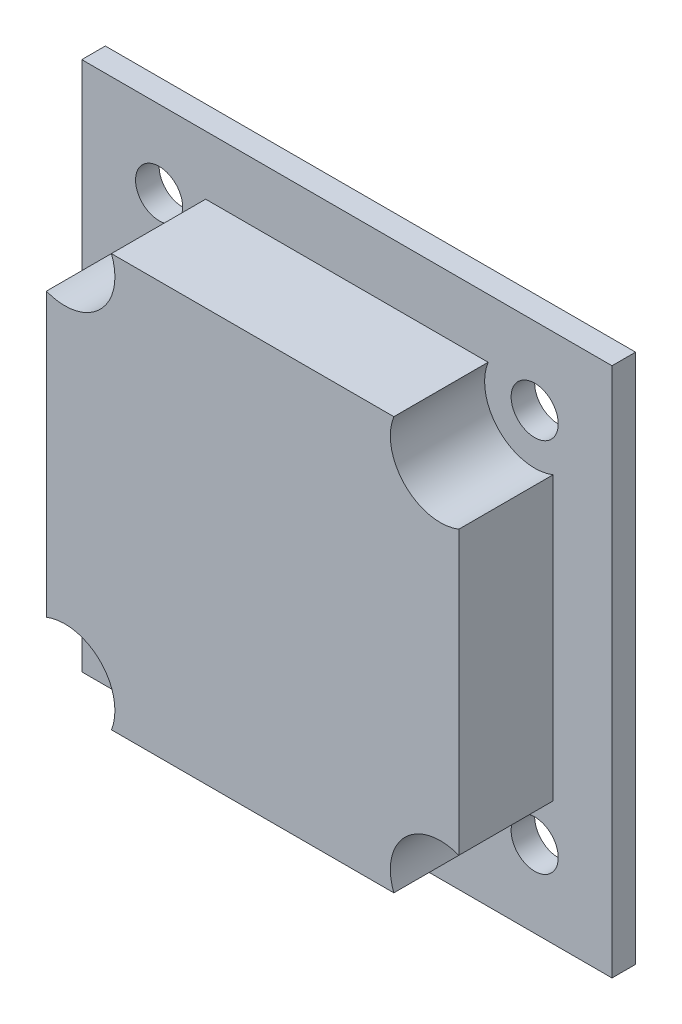
ISO-10303-21;
HEADER;
FILE_DESCRIPTION(('STEP AP214'),'2;1');
FILE_NAME('part.step','',(''),(''),'','','');
FILE_SCHEMA(('AUTOMOTIVE_DESIGN { 1 0 10303 214 1 1 1 1 }'));
ENDSEC;
DATA;
#1=APPLICATION_CONTEXT('core data for automotive mechanical design processes');
#2=APPLICATION_PROTOCOL_DEFINITION('international standard','automotive_design',2000,#1);
#3=PRODUCT_CONTEXT('',#1,'mechanical');
#4=PRODUCT('Part','Part','',(#3));
#5=PRODUCT_RELATED_PRODUCT_CATEGORY('part','',(#4));
#6=PRODUCT_DEFINITION_FORMATION('','',#4);
#7=PRODUCT_DEFINITION_CONTEXT('part definition',#1,'design');
#8=PRODUCT_DEFINITION('design','',#6,#7);
#9=PRODUCT_DEFINITION_SHAPE('','',#8);
#10=(LENGTH_UNIT() NAMED_UNIT(*) SI_UNIT(.MILLI.,.METRE.));
#11=(NAMED_UNIT(*) PLANE_ANGLE_UNIT() SI_UNIT($,.RADIAN.));
#12=(NAMED_UNIT(*) SI_UNIT($,.STERADIAN.) SOLID_ANGLE_UNIT());
#13=UNCERTAINTY_MEASURE_WITH_UNIT(LENGTH_MEASURE(1.E-05),#10,'distance_accuracy_value','');
#14=(GEOMETRIC_REPRESENTATION_CONTEXT(3) GLOBAL_UNCERTAINTY_ASSIGNED_CONTEXT((#13)) GLOBAL_UNIT_ASSIGNED_CONTEXT((#10,
#11,#12)) REPRESENTATION_CONTEXT('',''));
#15=CARTESIAN_POINT('',(0.,0.,0.));
#16=DIRECTION('',(0.,0.,1.));
#17=DIRECTION('',(1.,0.,0.));
#18=AXIS2_PLACEMENT_3D('',#15,#16,#17);
#19=CARTESIAN_POINT('',(0.,0.,12.));
#20=DIRECTION('',(0.,0.,1.));
#21=DIRECTION('',(1.,0.,0.));
#22=AXIS2_PLACEMENT_3D('',#19,#20,#21);
#23=PLANE('',#22);
#24=DIRECTION('',(-1.,0.,0.));
#25=VECTOR('',#24,1.);
#26=CARTESIAN_POINT('',(14.,14.,12.));
#27=LINE('',#26,#25);
#28=CARTESIAN_POINT('',(9.588117649248,14.,12.));
#29=VERTEX_POINT('',#28);
#30=CARTESIAN_POINT('',(-9.588117649248,14.,12.));
#31=VERTEX_POINT('',#30);
#32=EDGE_CURVE('E210',#29,#31,#27,.T.);
#33=ORIENTED_EDGE('',*,*,#32,.T.);
#34=CARTESIAN_POINT('',(-12.75,12.75,12.));
#35=DIRECTION('',(0.,0.,-1.));
#36=DIRECTION('',(0.92996539727996,0.367647058823984,0.));
#37=AXIS2_PLACEMENT_3D('',#34,#35,#36);
#38=CIRCLE('',#37,3.4);
#39=CARTESIAN_POINT('',(-14.,9.588117649248,12.));
#40=VERTEX_POINT('',#39);
#41=EDGE_CURVE('E209',#31,#40,#38,.T.);
#42=ORIENTED_EDGE('',*,*,#41,.T.);
#43=DIRECTION('',(0.,-1.,0.));
#44=VECTOR('',#43,1.);
#45=CARTESIAN_POINT('',(-14.,14.,12.));
#46=LINE('',#45,#44);
#47=CARTESIAN_POINT('',(-14.,-9.588117649248,12.));
#48=VERTEX_POINT('',#47);
#49=EDGE_CURVE('E23',#40,#48,#46,.T.);
#50=ORIENTED_EDGE('',*,*,#49,.T.);
#51=CARTESIAN_POINT('',(-12.75,-12.75,12.));
#52=DIRECTION('',(0.,0.,-1.));
#53=DIRECTION('',(-0.367647058823984,0.92996539727996,0.));
#54=AXIS2_PLACEMENT_3D('',#51,#52,#53);
#55=CIRCLE('',#54,3.4);
#56=CARTESIAN_POINT('',(-9.588117649248,-14.,12.));
#57=VERTEX_POINT('',#56);
#58=EDGE_CURVE('E9',#48,#57,#55,.T.);
#59=ORIENTED_EDGE('',*,*,#58,.T.);
#60=DIRECTION('',(1.,0.,0.));
#61=VECTOR('',#60,1.);
#62=CARTESIAN_POINT('',(-14.,-14.,12.));
#63=LINE('',#62,#61);
#64=CARTESIAN_POINT('',(9.588117649248,-14.,12.));
#65=VERTEX_POINT('',#64);
#66=EDGE_CURVE('E190',#57,#65,#63,.T.);
#67=ORIENTED_EDGE('',*,*,#66,.T.);
#68=CARTESIAN_POINT('',(12.75,-12.75,12.));
#69=DIRECTION('',(0.,0.,-1.));
#70=DIRECTION('',(1.,0.,0.));
#71=AXIS2_PLACEMENT_3D('',#68,#69,#70);
#72=CIRCLE('',#71,3.4);
#73=CARTESIAN_POINT('',(14.,-9.588117649248,12.));
#74=VERTEX_POINT('',#73);
#75=EDGE_CURVE('E178',#65,#74,#72,.T.);
#76=ORIENTED_EDGE('',*,*,#75,.T.);
#77=DIRECTION('',(0.,1.,0.));
#78=VECTOR('',#77,1.);
#79=CARTESIAN_POINT('',(14.,-14.,12.));
#80=LINE('',#79,#78);
#81=CARTESIAN_POINT('',(14.,9.588117649248,12.));
#82=VERTEX_POINT('',#81);
#83=EDGE_CURVE('E162',#74,#82,#80,.T.);
#84=ORIENTED_EDGE('',*,*,#83,.T.);
#85=CARTESIAN_POINT('',(12.75,12.75,12.));
#86=DIRECTION('',(0.,0.,-1.));
#87=DIRECTION('',(1.,0.,0.));
#88=AXIS2_PLACEMENT_3D('',#85,#86,#87);
#89=CIRCLE('',#88,3.4);
#90=EDGE_CURVE('E203',#82,#29,#89,.T.);
#91=ORIENTED_EDGE('',*,*,#90,.T.);
#92=EDGE_LOOP('',(#33,#42,#50,#59,#67,#76,#84,#91));
#93=FACE_BOUND('',#92,.T.);
#94=ADVANCED_FACE('F15',(#93),#23,.T.);
#95=CARTESIAN_POINT('',(-12.75,-12.75,4.));
#96=DIRECTION('',(0.,0.,-1.));
#97=DIRECTION('',(1.,0.,0.));
#98=AXIS2_PLACEMENT_3D('',#95,#96,#97);
#99=CYLINDRICAL_SURFACE('',#98,3.4);
#100=ORIENTED_EDGE('',*,*,#58,.F.);
#101=DIRECTION('',(0.,0.,-1.));
#102=VECTOR('',#101,1.);
#103=CARTESIAN_POINT('',(-14.,-9.588117649248,4.));
#104=LINE('',#103,#102);
#105=CARTESIAN_POINT('',(-14.,-9.588117649248,5.6));
#106=VERTEX_POINT('',#105);
#107=EDGE_CURVE('E212',#48,#106,#104,.T.);
#108=ORIENTED_EDGE('',*,*,#107,.T.);
#109=CARTESIAN_POINT('',(-12.75,-12.75,5.6));
#110=DIRECTION('',(0.,0.,1.));
#111=DIRECTION('',(0.92996539727996,-0.367647058823984,0.));
#112=AXIS2_PLACEMENT_3D('',#109,#110,#111);
#113=CIRCLE('',#112,3.4);
#114=CARTESIAN_POINT('',(-9.588117649248,-14.,5.6));
#115=VERTEX_POINT('',#114);
#116=EDGE_CURVE('E226',#115,#106,#113,.T.);
#117=ORIENTED_EDGE('',*,*,#116,.F.);
#118=DIRECTION('',(0.,0.,-1.));
#119=VECTOR('',#118,1.);
#120=CARTESIAN_POINT('',(-9.588117649248,-14.,4.));
#121=LINE('',#120,#119);
#122=EDGE_CURVE('E189',#57,#115,#121,.T.);
#123=ORIENTED_EDGE('',*,*,#122,.F.);
#124=EDGE_LOOP('',(#100,#108,#117,#123));
#125=FACE_BOUND('',#124,.T.);
#126=ADVANCED_FACE('F223',(#125),#99,.F.);
#127=CARTESIAN_POINT('',(-14.,14.,5.6));
#128=DIRECTION('',(1.,0.,0.));
#129=DIRECTION('',(0.,1.,0.));
#130=AXIS2_PLACEMENT_3D('',#127,#128,#129);
#131=PLANE('',#130);
#132=ORIENTED_EDGE('',*,*,#107,.F.);
#133=ORIENTED_EDGE('',*,*,#49,.F.);
#134=DIRECTION('',(0.,0.,-1.));
#135=VECTOR('',#134,1.);
#136=CARTESIAN_POINT('',(-14.,9.588117649248,4.));
#137=LINE('',#136,#135);
#138=CARTESIAN_POINT('',(-14.,9.588117649248,5.6));
#139=VERTEX_POINT('',#138);
#140=EDGE_CURVE('E211',#40,#139,#137,.T.);
#141=ORIENTED_EDGE('',*,*,#140,.T.);
#142=DIRECTION('',(0.,-1.,0.));
#143=VECTOR('',#142,1.);
#144=CARTESIAN_POINT('',(-14.,14.,5.6));
#145=LINE('',#144,#143);
#146=EDGE_CURVE('E225',#139,#106,#145,.T.);
#147=ORIENTED_EDGE('',*,*,#146,.T.);
#148=EDGE_LOOP('',(#132,#133,#141,#147));
#149=FACE_BOUND('',#148,.T.);
#150=ADVANCED_FACE('F219',(#149),#131,.F.);
#151=CARTESIAN_POINT('',(-12.75,12.75,4.));
#152=DIRECTION('',(0.,0.,-1.));
#153=DIRECTION('',(1.,0.,0.));
#154=AXIS2_PLACEMENT_3D('',#151,#152,#153);
#155=CYLINDRICAL_SURFACE('',#154,3.4);
#156=ORIENTED_EDGE('',*,*,#41,.F.);
#157=DIRECTION('',(0.,0.,-1.));
#158=VECTOR('',#157,1.);
#159=CARTESIAN_POINT('',(-9.588117649248,14.,4.));
#160=LINE('',#159,#158);
#161=CARTESIAN_POINT('',(-9.588117649248,14.,5.6));
#162=VERTEX_POINT('',#161);
#163=EDGE_CURVE('E204',#31,#162,#160,.T.);
#164=ORIENTED_EDGE('',*,*,#163,.T.);
#165=CARTESIAN_POINT('',(-12.75,12.75,5.6));
#166=DIRECTION('',(0.,0.,1.));
#167=DIRECTION('',(-0.367647058823984,-0.92996539727996,0.));
#168=AXIS2_PLACEMENT_3D('',#165,#166,#167);
#169=CIRCLE('',#168,3.4);
#170=EDGE_CURVE('E246',#139,#162,#169,.T.);
#171=ORIENTED_EDGE('',*,*,#170,.F.);
#172=ORIENTED_EDGE('',*,*,#140,.F.);
#173=EDGE_LOOP('',(#156,#164,#171,#172));
#174=FACE_BOUND('',#173,.T.);
#175=ADVANCED_FACE('F309',(#174),#155,.F.);
#176=CARTESIAN_POINT('',(14.,14.,5.6));
#177=DIRECTION('',(0.,-1.,0.));
#178=DIRECTION('',(0.,0.,-1.));
#179=AXIS2_PLACEMENT_3D('',#176,#177,#178);
#180=PLANE('',#179);
#181=ORIENTED_EDGE('',*,*,#163,.F.);
#182=ORIENTED_EDGE('',*,*,#32,.F.);
#183=DIRECTION('',(0.,0.,-1.));
#184=VECTOR('',#183,1.);
#185=CARTESIAN_POINT('',(9.588117649248,14.,4.));
#186=LINE('',#185,#184);
#187=CARTESIAN_POINT('',(9.588117649248,14.,5.6));
#188=VERTEX_POINT('',#187);
#189=EDGE_CURVE('E173',#29,#188,#186,.T.);
#190=ORIENTED_EDGE('',*,*,#189,.T.);
#191=DIRECTION('',(-1.,0.,0.));
#192=VECTOR('',#191,1.);
#193=CARTESIAN_POINT('',(14.,14.,5.6));
#194=LINE('',#193,#192);
#195=EDGE_CURVE('E251',#188,#162,#194,.T.);
#196=ORIENTED_EDGE('',*,*,#195,.T.);
#197=EDGE_LOOP('',(#181,#182,#190,#196));
#198=FACE_BOUND('',#197,.T.);
#199=ADVANCED_FACE('F323',(#198),#180,.F.);
#200=CARTESIAN_POINT('',(12.75,12.75,4.));
#201=DIRECTION('',(0.,0.,-1.));
#202=DIRECTION('',(1.,0.,0.));
#203=AXIS2_PLACEMENT_3D('',#200,#201,#202);
#204=CYLINDRICAL_SURFACE('',#203,3.4);
#205=DIRECTION('',(0.,0.,-1.));
#206=VECTOR('',#205,1.);
#207=CARTESIAN_POINT('',(14.,9.588117649248,4.));
#208=LINE('',#207,#206);
#209=CARTESIAN_POINT('',(14.,9.588117649248,5.6));
#210=VERTEX_POINT('',#209);
#211=EDGE_CURVE('E166',#82,#210,#208,.T.);
#212=ORIENTED_EDGE('',*,*,#211,.T.);
#213=CARTESIAN_POINT('',(12.75,12.75,5.6));
#214=DIRECTION('',(0.,0.,-1.));
#215=DIRECTION('',(1.,0.,0.));
#216=AXIS2_PLACEMENT_3D('',#213,#214,#215);
#217=CIRCLE('',#216,3.4);
#218=EDGE_CURVE('E260',#210,#188,#217,.T.);
#219=ORIENTED_EDGE('',*,*,#218,.T.);
#220=ORIENTED_EDGE('',*,*,#189,.F.);
#221=ORIENTED_EDGE('',*,*,#90,.F.);
#222=EDGE_LOOP('',(#212,#219,#220,#221));
#223=FACE_BOUND('',#222,.T.);
#224=ADVANCED_FACE('F337',(#223),#204,.F.);
#225=CARTESIAN_POINT('',(14.,-14.,5.6));
#226=DIRECTION('',(-1.,0.,0.));
#227=DIRECTION('',(0.,0.,1.));
#228=AXIS2_PLACEMENT_3D('',#225,#226,#227);
#229=PLANE('',#228);
#230=ORIENTED_EDGE('',*,*,#211,.F.);
#231=ORIENTED_EDGE('',*,*,#83,.F.);
#232=DIRECTION('',(0.,0.,-1.));
#233=VECTOR('',#232,1.);
#234=CARTESIAN_POINT('',(14.,-9.588117649248,4.));
#235=LINE('',#234,#233);
#236=CARTESIAN_POINT('',(14.,-9.588117649248,5.6));
#237=VERTEX_POINT('',#236);
#238=EDGE_CURVE('E170',#74,#237,#235,.T.);
#239=ORIENTED_EDGE('',*,*,#238,.T.);
#240=DIRECTION('',(0.,1.,0.));
#241=VECTOR('',#240,1.);
#242=CARTESIAN_POINT('',(14.,-14.,5.6));
#243=LINE('',#242,#241);
#244=EDGE_CURVE('E261',#237,#210,#243,.T.);
#245=ORIENTED_EDGE('',*,*,#244,.T.);
#246=EDGE_LOOP('',(#230,#231,#239,#245));
#247=FACE_BOUND('',#246,.T.);
#248=ADVANCED_FACE('F164',(#247),#229,.F.);
#249=CARTESIAN_POINT('',(12.75,-12.75,4.));
#250=DIRECTION('',(0.,0.,-1.));
#251=DIRECTION('',(1.,0.,0.));
#252=AXIS2_PLACEMENT_3D('',#249,#250,#251);
#253=CYLINDRICAL_SURFACE('',#252,3.4);
#254=ORIENTED_EDGE('',*,*,#75,.F.);
#255=DIRECTION('',(0.,0.,-1.));
#256=VECTOR('',#255,1.);
#257=CARTESIAN_POINT('',(9.588117649248,-14.,4.));
#258=LINE('',#257,#256);
#259=CARTESIAN_POINT('',(9.588117649248,-14.,5.6));
#260=VERTEX_POINT('',#259);
#261=EDGE_CURVE('E250',#65,#260,#258,.T.);
#262=ORIENTED_EDGE('',*,*,#261,.T.);
#263=CARTESIAN_POINT('',(12.75,-12.75,5.6));
#264=DIRECTION('',(0.,0.,-1.));
#265=DIRECTION('',(1.,0.,0.));
#266=AXIS2_PLACEMENT_3D('',#263,#264,#265);
#267=CIRCLE('',#266,3.4);
#268=EDGE_CURVE('E185',#260,#237,#267,.T.);
#269=ORIENTED_EDGE('',*,*,#268,.T.);
#270=ORIENTED_EDGE('',*,*,#238,.F.);
#271=EDGE_LOOP('',(#254,#262,#269,#270));
#272=FACE_BOUND('',#271,.T.);
#273=ADVANCED_FACE('F180',(#272),#253,.F.);
#274=CARTESIAN_POINT('',(-14.,-14.,5.6));
#275=DIRECTION('',(0.,1.,0.));
#276=DIRECTION('',(1.,0.,0.));
#277=AXIS2_PLACEMENT_3D('',#274,#275,#276);
#278=PLANE('',#277);
#279=ORIENTED_EDGE('',*,*,#261,.F.);
#280=ORIENTED_EDGE('',*,*,#66,.F.);
#281=ORIENTED_EDGE('',*,*,#122,.T.);
#282=DIRECTION('',(1.,0.,0.));
#283=VECTOR('',#282,1.);
#284=CARTESIAN_POINT('',(-14.,-14.,5.6));
#285=LINE('',#284,#283);
#286=EDGE_CURVE('E230',#115,#260,#285,.T.);
#287=ORIENTED_EDGE('',*,*,#286,.T.);
#288=EDGE_LOOP('',(#279,#280,#281,#287));
#289=FACE_BOUND('',#288,.T.);
#290=ADVANCED_FACE('F288',(#289),#278,.F.);
#291=CARTESIAN_POINT('',(12.75,12.75,3.));
#292=DIRECTION('',(0.,0.,-1.));
#293=DIRECTION('',(1.,0.,0.));
#294=AXIS2_PLACEMENT_3D('',#291,#292,#293);
#295=CYLINDRICAL_SURFACE('',#294,1.6);
#296=CARTESIAN_POINT('',(12.75,12.75,4.));
#297=DIRECTION('',(0.,0.,-1.));
#298=DIRECTION('',(1.,0.,0.));
#299=AXIS2_PLACEMENT_3D('',#296,#297,#298);
#300=CIRCLE('',#299,1.6);
#301=CARTESIAN_POINT('',(14.35,12.75,4.));
#302=VERTEX_POINT('',#301);
#303=EDGE_CURVE('E358',#302,#302,#300,.T.);
#304=ORIENTED_EDGE('',*,*,#303,.T.);
#305=DIRECTION('',(0.,0.,1.));
#306=VECTOR('',#305,1.);
#307=CARTESIAN_POINT('',(14.35,12.75,3.));
#308=LINE('',#307,#306);
#309=CARTESIAN_POINT('',(14.35,12.75,5.6));
#310=VERTEX_POINT('',#309);
#311=EDGE_CURVE('E283',#302,#310,#308,.T.);
#312=ORIENTED_EDGE('',*,*,#311,.T.);
#313=CARTESIAN_POINT('',(12.75,12.75,5.6));
#314=DIRECTION('',(0.,0.,-1.));
#315=DIRECTION('',(1.,0.,0.));
#316=AXIS2_PLACEMENT_3D('',#313,#314,#315);
#317=CIRCLE('',#316,1.6);
#318=EDGE_CURVE('E271',#310,#310,#317,.T.);
#319=ORIENTED_EDGE('',*,*,#318,.F.);
#320=ORIENTED_EDGE('',*,*,#311,.F.);
#321=EDGE_LOOP('',(#304,#312,#319,#320));
#322=FACE_BOUND('',#321,.T.);
#323=ADVANCED_FACE('F289',(#322),#295,.F.);
#324=CARTESIAN_POINT('',(-12.75,12.75,3.));
#325=DIRECTION('',(0.,0.,-1.));
#326=DIRECTION('',(1.,0.,0.));
#327=AXIS2_PLACEMENT_3D('',#324,#325,#326);
#328=CYLINDRICAL_SURFACE('',#327,1.6);
#329=CARTESIAN_POINT('',(-12.75,12.75,4.));
#330=DIRECTION('',(0.,0.,-1.));
#331=DIRECTION('',(1.,0.,0.));
#332=AXIS2_PLACEMENT_3D('',#329,#330,#331);
#333=CIRCLE('',#332,1.6);
#334=CARTESIAN_POINT('',(-11.15,12.75,4.));
#335=VERTEX_POINT('',#334);
#336=EDGE_CURVE('E357',#335,#335,#333,.T.);
#337=ORIENTED_EDGE('',*,*,#336,.T.);
#338=DIRECTION('',(0.,0.,1.));
#339=VECTOR('',#338,1.);
#340=CARTESIAN_POINT('',(-11.15,12.75,3.));
#341=LINE('',#340,#339);
#342=CARTESIAN_POINT('',(-11.15,12.75,5.6));
#343=VERTEX_POINT('',#342);
#344=EDGE_CURVE('E281',#335,#343,#341,.T.);
#345=ORIENTED_EDGE('',*,*,#344,.T.);
#346=CARTESIAN_POINT('',(-12.75,12.75,5.6));
#347=DIRECTION('',(0.,0.,-1.));
#348=DIRECTION('',(1.,0.,0.));
#349=AXIS2_PLACEMENT_3D('',#346,#347,#348);
#350=CIRCLE('',#349,1.6);
#351=EDGE_CURVE('E270',#343,#343,#350,.T.);
#352=ORIENTED_EDGE('',*,*,#351,.F.);
#353=ORIENTED_EDGE('',*,*,#344,.F.);
#354=EDGE_LOOP('',(#337,#345,#352,#353));
#355=FACE_BOUND('',#354,.T.);
#356=ADVANCED_FACE('F300',(#355),#328,.F.);
#357=CARTESIAN_POINT('',(12.75,-12.75,3.));
#358=DIRECTION('',(0.,0.,-1.));
#359=DIRECTION('',(1.,0.,0.));
#360=AXIS2_PLACEMENT_3D('',#357,#358,#359);
#361=CYLINDRICAL_SURFACE('',#360,1.6);
#362=CARTESIAN_POINT('',(12.75,-12.75,4.));
#363=DIRECTION('',(0.,0.,-1.));
#364=DIRECTION('',(1.,0.,0.));
#365=AXIS2_PLACEMENT_3D('',#362,#363,#364);
#366=CIRCLE('',#365,1.6);
#367=CARTESIAN_POINT('',(14.35,-12.75,4.));
#368=VERTEX_POINT('',#367);
#369=EDGE_CURVE('E363',#368,#368,#366,.T.);
#370=ORIENTED_EDGE('',*,*,#369,.T.);
#371=DIRECTION('',(0.,0.,1.));
#372=VECTOR('',#371,1.);
#373=CARTESIAN_POINT('',(14.35,-12.75,3.));
#374=LINE('',#373,#372);
#375=CARTESIAN_POINT('',(14.35,-12.75,5.6));
#376=VERTEX_POINT('',#375);
#377=EDGE_CURVE('E279',#368,#376,#374,.T.);
#378=ORIENTED_EDGE('',*,*,#377,.T.);
#379=CARTESIAN_POINT('',(12.75,-12.75,5.6));
#380=DIRECTION('',(0.,0.,-1.));
#381=DIRECTION('',(1.,0.,0.));
#382=AXIS2_PLACEMENT_3D('',#379,#380,#381);
#383=CIRCLE('',#382,1.6);
#384=EDGE_CURVE('E266',#376,#376,#383,.T.);
#385=ORIENTED_EDGE('',*,*,#384,.F.);
#386=ORIENTED_EDGE('',*,*,#377,.F.);
#387=EDGE_LOOP('',(#370,#378,#385,#386));
#388=FACE_BOUND('',#387,.T.);
#389=ADVANCED_FACE('F328',(#388),#361,.F.);
#390=CARTESIAN_POINT('',(-12.75,-12.75,3.));
#391=DIRECTION('',(0.,0.,-1.));
#392=DIRECTION('',(1.,0.,0.));
#393=AXIS2_PLACEMENT_3D('',#390,#391,#392);
#394=CYLINDRICAL_SURFACE('',#393,1.6);
#395=CARTESIAN_POINT('',(-12.75,-12.75,4.));
#396=DIRECTION('',(0.,0.,-1.));
#397=DIRECTION('',(1.,0.,0.));
#398=AXIS2_PLACEMENT_3D('',#395,#396,#397);
#399=CIRCLE('',#398,1.6);
#400=CARTESIAN_POINT('',(-11.15,-12.75,4.));
#401=VERTEX_POINT('',#400);
#402=EDGE_CURVE('E371',#401,#401,#399,.T.);
#403=ORIENTED_EDGE('',*,*,#402,.T.);
#404=DIRECTION('',(0.,0.,1.));
#405=VECTOR('',#404,1.);
#406=CARTESIAN_POINT('',(-11.15,-12.75,3.));
#407=LINE('',#406,#405);
#408=CARTESIAN_POINT('',(-11.15,-12.75,5.6));
#409=VERTEX_POINT('',#408);
#410=EDGE_CURVE('E274',#401,#409,#407,.T.);
#411=ORIENTED_EDGE('',*,*,#410,.T.);
#412=CARTESIAN_POINT('',(-12.75,-12.75,5.6));
#413=DIRECTION('',(0.,0.,-1.));
#414=DIRECTION('',(1.,0.,0.));
#415=AXIS2_PLACEMENT_3D('',#412,#413,#414);
#416=CIRCLE('',#415,1.6);
#417=EDGE_CURVE('E236',#409,#409,#416,.T.);
#418=ORIENTED_EDGE('',*,*,#417,.F.);
#419=ORIENTED_EDGE('',*,*,#410,.F.);
#420=EDGE_LOOP('',(#403,#411,#418,#419));
#421=FACE_BOUND('',#420,.T.);
#422=ADVANCED_FACE('F335',(#421),#394,.F.);
#423=CARTESIAN_POINT('',(18.,18.,4.));
#424=DIRECTION('',(0.,-1.,0.));
#425=DIRECTION('',(0.,0.,-1.));
#426=AXIS2_PLACEMENT_3D('',#423,#424,#425);
#427=PLANE('',#426);
#428=DIRECTION('',(-1.,0.,0.));
#429=VECTOR('',#428,1.);
#430=CARTESIAN_POINT('',(18.,18.,4.));
#431=LINE('',#430,#429);
#432=CARTESIAN_POINT('',(18.,18.,4.));
#433=VERTEX_POINT('',#432);
#434=CARTESIAN_POINT('',(-18.,18.,4.));
#435=VERTEX_POINT('',#434);
#436=EDGE_CURVE('E382',#433,#435,#431,.T.);
#437=ORIENTED_EDGE('',*,*,#436,.T.);
#438=DIRECTION('',(0.,0.,1.));
#439=VECTOR('',#438,1.);
#440=CARTESIAN_POINT('',(-18.,18.,4.));
#441=LINE('',#440,#439);
#442=CARTESIAN_POINT('',(-18.,18.,5.6));
#443=VERTEX_POINT('',#442);
#444=EDGE_CURVE('E400',#435,#443,#441,.T.);
#445=ORIENTED_EDGE('',*,*,#444,.T.);
#446=DIRECTION('',(-1.,0.,0.));
#447=VECTOR('',#446,1.);
#448=CARTESIAN_POINT('',(18.,18.,5.6));
#449=LINE('',#448,#447);
#450=CARTESIAN_POINT('',(18.,18.,5.6));
#451=VERTEX_POINT('',#450);
#452=EDGE_CURVE('E242',#451,#443,#449,.T.);
#453=ORIENTED_EDGE('',*,*,#452,.F.);
#454=DIRECTION('',(0.,0.,1.));
#455=VECTOR('',#454,1.);
#456=CARTESIAN_POINT('',(18.,18.,4.));
#457=LINE('',#456,#455);
#458=EDGE_CURVE('E383',#433,#451,#457,.T.);
#459=ORIENTED_EDGE('',*,*,#458,.F.);
#460=EDGE_LOOP('',(#437,#445,#453,#459));
#461=FACE_BOUND('',#460,.T.);
#462=ADVANCED_FACE('F343',(#461),#427,.F.);
#463=CARTESIAN_POINT('',(0.,0.,5.6));
#464=DIRECTION('',(0.,0.,1.));
#465=DIRECTION('',(1.,0.,0.));
#466=AXIS2_PLACEMENT_3D('',#463,#464,#465);
#467=PLANE('',#466);
#468=ORIENTED_EDGE('',*,*,#318,.T.);
#469=EDGE_LOOP('',(#468));
#470=FACE_BOUND('',#469,.T.);
#471=ORIENTED_EDGE('',*,*,#351,.T.);
#472=EDGE_LOOP('',(#471));
#473=FACE_BOUND('',#472,.T.);
#474=ORIENTED_EDGE('',*,*,#384,.T.);
#475=EDGE_LOOP('',(#474));
#476=FACE_BOUND('',#475,.T.);
#477=ORIENTED_EDGE('',*,*,#286,.F.);
#478=ORIENTED_EDGE('',*,*,#116,.T.);
#479=ORIENTED_EDGE('',*,*,#146,.F.);
#480=ORIENTED_EDGE('',*,*,#170,.T.);
#481=ORIENTED_EDGE('',*,*,#195,.F.);
#482=ORIENTED_EDGE('',*,*,#218,.F.);
#483=ORIENTED_EDGE('',*,*,#244,.F.);
#484=ORIENTED_EDGE('',*,*,#268,.F.);
#485=EDGE_LOOP('',(#477,#478,#479,#480,#481,#482,#483,#484));
#486=FACE_BOUND('',#485,.T.);
#487=ORIENTED_EDGE('',*,*,#417,.T.);
#488=EDGE_LOOP('',(#487));
#489=FACE_BOUND('',#488,.T.);
#490=DIRECTION('',(1.,0.,0.));
#491=VECTOR('',#490,1.);
#492=CARTESIAN_POINT('',(-18.,-18.,5.6));
#493=LINE('',#492,#491);
#494=CARTESIAN_POINT('',(-18.,-18.,5.6));
#495=VERTEX_POINT('',#494);
#496=CARTESIAN_POINT('',(18.,-18.,5.6));
#497=VERTEX_POINT('',#496);
#498=EDGE_CURVE('E412',#495,#497,#493,.T.);
#499=ORIENTED_EDGE('',*,*,#498,.T.);
#500=DIRECTION('',(0.,1.,0.));
#501=VECTOR('',#500,1.);
#502=CARTESIAN_POINT('',(18.,-18.,5.6));
#503=LINE('',#502,#501);
#504=EDGE_CURVE('E377',#497,#451,#503,.T.);
#505=ORIENTED_EDGE('',*,*,#504,.T.);
#506=ORIENTED_EDGE('',*,*,#452,.T.);
#507=DIRECTION('',(0.,-1.,0.));
#508=VECTOR('',#507,1.);
#509=CARTESIAN_POINT('',(-18.,18.,5.6));
#510=LINE('',#509,#508);
#511=EDGE_CURVE('E392',#443,#495,#510,.T.);
#512=ORIENTED_EDGE('',*,*,#511,.T.);
#513=EDGE_LOOP('',(#499,#505,#506,#512));
#514=FACE_BOUND('',#513,.T.);
#515=ADVANCED_FACE('F233',(#470,#473,#476,#486,#489,#514),#467,.T.);
#516=CARTESIAN_POINT('',(0.,0.,4.));
#517=DIRECTION('',(0.,0.,1.));
#518=DIRECTION('',(1.,0.,0.));
#519=AXIS2_PLACEMENT_3D('',#516,#517,#518);
#520=PLANE('',#519);
#521=ORIENTED_EDGE('',*,*,#303,.F.);
#522=EDGE_LOOP('',(#521));
#523=FACE_BOUND('',#522,.T.);
#524=ORIENTED_EDGE('',*,*,#336,.F.);
#525=EDGE_LOOP('',(#524));
#526=FACE_BOUND('',#525,.T.);
#527=ORIENTED_EDGE('',*,*,#369,.F.);
#528=EDGE_LOOP('',(#527));
#529=FACE_BOUND('',#528,.T.);
#530=ORIENTED_EDGE('',*,*,#402,.F.);
#531=EDGE_LOOP('',(#530));
#532=FACE_BOUND('',#531,.T.);
#533=DIRECTION('',(0.,-1.,0.));
#534=VECTOR('',#533,1.);
#535=CARTESIAN_POINT('',(-18.,18.,4.));
#536=LINE('',#535,#534);
#537=CARTESIAN_POINT('',(-18.,-18.,4.));
#538=VERTEX_POINT('',#537);
#539=EDGE_CURVE('E402',#435,#538,#536,.T.);
#540=ORIENTED_EDGE('',*,*,#539,.F.);
#541=ORIENTED_EDGE('',*,*,#436,.F.);
#542=DIRECTION('',(0.,1.,0.));
#543=VECTOR('',#542,1.);
#544=CARTESIAN_POINT('',(18.,-18.,4.));
#545=LINE('',#544,#543);
#546=CARTESIAN_POINT('',(18.,-18.,4.));
#547=VERTEX_POINT('',#546);
#548=EDGE_CURVE('E374',#547,#433,#545,.T.);
#549=ORIENTED_EDGE('',*,*,#548,.F.);
#550=DIRECTION('',(1.,0.,0.));
#551=VECTOR('',#550,1.);
#552=CARTESIAN_POINT('',(-18.,-18.,4.));
#553=LINE('',#552,#551);
#554=EDGE_CURVE('E430',#538,#547,#553,.T.);
#555=ORIENTED_EDGE('',*,*,#554,.F.);
#556=EDGE_LOOP('',(#540,#541,#549,#555));
#557=FACE_BOUND('',#556,.T.);
#558=ADVANCED_FACE('F324',(#523,#526,#529,#532,#557),#520,.F.);
#559=CARTESIAN_POINT('',(18.,-18.,4.));
#560=DIRECTION('',(-1.,0.,0.));
#561=DIRECTION('',(0.,0.,1.));
#562=AXIS2_PLACEMENT_3D('',#559,#560,#561);
#563=PLANE('',#562);
#564=ORIENTED_EDGE('',*,*,#548,.T.);
#565=ORIENTED_EDGE('',*,*,#458,.T.);
#566=ORIENTED_EDGE('',*,*,#504,.F.);
#567=DIRECTION('',(0.,0.,1.));
#568=VECTOR('',#567,1.);
#569=CARTESIAN_POINT('',(18.,-18.,4.));
#570=LINE('',#569,#568);
#571=EDGE_CURVE('E429',#547,#497,#570,.T.);
#572=ORIENTED_EDGE('',*,*,#571,.F.);
#573=EDGE_LOOP('',(#564,#565,#566,#572));
#574=FACE_BOUND('',#573,.T.);
#575=ADVANCED_FACE('F317',(#574),#563,.F.);
#576=CARTESIAN_POINT('',(-18.,18.,4.));
#577=DIRECTION('',(1.,0.,0.));
#578=DIRECTION('',(0.,1.,0.));
#579=AXIS2_PLACEMENT_3D('',#576,#577,#578);
#580=PLANE('',#579);
#581=ORIENTED_EDGE('',*,*,#539,.T.);
#582=DIRECTION('',(0.,0.,1.));
#583=VECTOR('',#582,1.);
#584=CARTESIAN_POINT('',(-18.,-18.,4.));
#585=LINE('',#584,#583);
#586=EDGE_CURVE('E405',#538,#495,#585,.T.);
#587=ORIENTED_EDGE('',*,*,#586,.T.);
#588=ORIENTED_EDGE('',*,*,#511,.F.);
#589=ORIENTED_EDGE('',*,*,#444,.F.);
#590=EDGE_LOOP('',(#581,#587,#588,#589));
#591=FACE_BOUND('',#590,.T.);
#592=ADVANCED_FACE('F312',(#591),#580,.F.);
#593=CARTESIAN_POINT('',(-18.,-18.,4.));
#594=DIRECTION('',(0.,1.,0.));
#595=DIRECTION('',(1.,0.,0.));
#596=AXIS2_PLACEMENT_3D('',#593,#594,#595);
#597=PLANE('',#596);
#598=ORIENTED_EDGE('',*,*,#554,.T.);
#599=ORIENTED_EDGE('',*,*,#571,.T.);
#600=ORIENTED_EDGE('',*,*,#498,.F.);
#601=ORIENTED_EDGE('',*,*,#586,.F.);
#602=EDGE_LOOP('',(#598,#599,#600,#601));
#603=FACE_BOUND('',#602,.T.);
#604=ADVANCED_FACE('F315',(#603),#597,.F.);
#605=CLOSED_SHELL('',(#94,#126,#150,#175,#199,#224,#248,#273,#290,#323,#356,#389,#422,#462,#515,
#558,#575,#592,#604));
#606=MANIFOLD_SOLID_BREP('B1',#605);
#607=ADVANCED_BREP_SHAPE_REPRESENTATION('',(#18,#606),#14);
#608=SHAPE_DEFINITION_REPRESENTATION(#9,#607);
ENDSEC;
END-ISO-10303-21;
